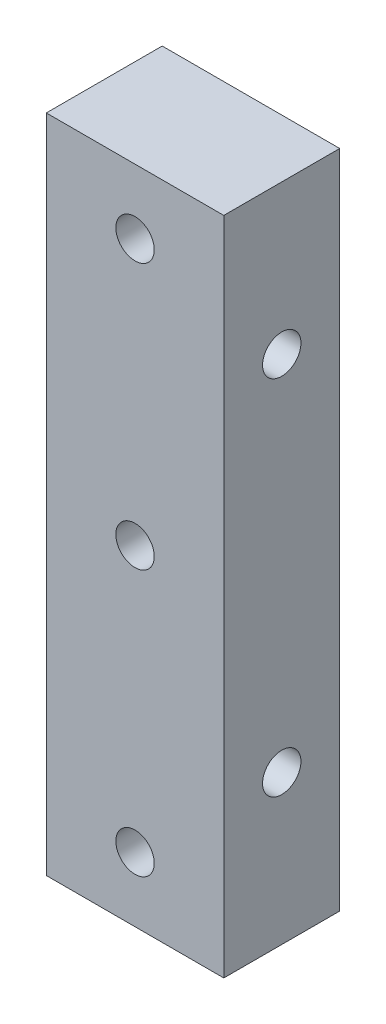
ISO-10303-21;
HEADER;
FILE_DESCRIPTION(('STEP AP214'),'2;1');
FILE_NAME('part.step','',(''),(''),'','','');
FILE_SCHEMA(('AUTOMOTIVE_DESIGN { 1 0 10303 214 1 1 1 1 }'));
ENDSEC;
DATA;
#1=APPLICATION_CONTEXT('core data for automotive mechanical design processes');
#2=APPLICATION_PROTOCOL_DEFINITION('international standard','automotive_design',2000,#1);
#3=PRODUCT_CONTEXT('',#1,'mechanical');
#4=PRODUCT('Part','Part','',(#3));
#5=PRODUCT_RELATED_PRODUCT_CATEGORY('part','',(#4));
#6=PRODUCT_DEFINITION_FORMATION('','',#4);
#7=PRODUCT_DEFINITION_CONTEXT('part definition',#1,'design');
#8=PRODUCT_DEFINITION('design','',#6,#7);
#9=PRODUCT_DEFINITION_SHAPE('','',#8);
#10=(LENGTH_UNIT() NAMED_UNIT(*) SI_UNIT(.MILLI.,.METRE.));
#11=(NAMED_UNIT(*) PLANE_ANGLE_UNIT() SI_UNIT($,.RADIAN.));
#12=(NAMED_UNIT(*) SI_UNIT($,.STERADIAN.) SOLID_ANGLE_UNIT());
#13=UNCERTAINTY_MEASURE_WITH_UNIT(LENGTH_MEASURE(1.E-05),#10,'distance_accuracy_value','');
#14=(GEOMETRIC_REPRESENTATION_CONTEXT(3) GLOBAL_UNCERTAINTY_ASSIGNED_CONTEXT((#13)) GLOBAL_UNIT_ASSIGNED_CONTEXT((#10,
#11,#12)) REPRESENTATION_CONTEXT('',''));
#15=CARTESIAN_POINT('',(0.,0.,0.));
#16=DIRECTION('',(0.,0.,1.));
#17=DIRECTION('',(1.,0.,0.));
#18=AXIS2_PLACEMENT_3D('',#15,#16,#17);
#19=CARTESIAN_POINT('',(9.33449999999999,34.7345,12.192));
#20=DIRECTION('',(-1.,0.,0.));
#21=DIRECTION('',(0.,-1.,0.));
#22=AXIS2_PLACEMENT_3D('',#19,#20,#21);
#23=PLANE('',#22);
#24=CARTESIAN_POINT('',(9.3345,19.05,6.09599999999999));
#25=DIRECTION('',(1.,0.,0.));
#26=DIRECTION('',(0.,0.,-1.));
#27=AXIS2_PLACEMENT_3D('',#24,#25,#26);
#28=CIRCLE('',#27,2.0193);
#29=CARTESIAN_POINT('',(9.3345,19.05,4.0767));
#30=VERTEX_POINT('',#29);
#31=EDGE_CURVE('E143',#30,#30,#28,.T.);
#32=ORIENTED_EDGE('',*,*,#31,.F.);
#33=EDGE_LOOP('',(#32));
#34=FACE_BOUND('',#33,.T.);
#35=CARTESIAN_POINT('',(9.3345,-19.05,6.09599999999999));
#36=DIRECTION('',(1.,0.,0.));
#37=DIRECTION('',(0.,0.,-1.));
#38=AXIS2_PLACEMENT_3D('',#35,#36,#37);
#39=CIRCLE('',#38,2.0193);
#40=CARTESIAN_POINT('',(9.3345,-19.05,4.0767));
#41=VERTEX_POINT('',#40);
#42=EDGE_CURVE('E135',#41,#41,#39,.T.);
#43=ORIENTED_EDGE('',*,*,#42,.F.);
#44=EDGE_LOOP('',(#43));
#45=FACE_BOUND('',#44,.T.);
#46=DIRECTION('',(0.,1.,0.));
#47=VECTOR('',#46,1.);
#48=CARTESIAN_POINT('',(9.33449999999999,34.7345,0.));
#49=LINE('',#48,#47);
#50=CARTESIAN_POINT('',(9.3345,-34.7345,0.));
#51=VERTEX_POINT('',#50);
#52=CARTESIAN_POINT('',(9.33449999999999,34.7345,0.));
#53=VERTEX_POINT('',#52);
#54=EDGE_CURVE('E111',#51,#53,#49,.T.);
#55=ORIENTED_EDGE('',*,*,#54,.T.);
#56=DIRECTION('',(0.,0.,-1.));
#57=VECTOR('',#56,1.);
#58=CARTESIAN_POINT('',(9.33449999999999,34.7345,12.192));
#59=LINE('',#58,#57);
#60=CARTESIAN_POINT('',(9.33449999999999,34.7345,12.192));
#61=VERTEX_POINT('',#60);
#62=EDGE_CURVE('E11',#61,#53,#59,.T.);
#63=ORIENTED_EDGE('',*,*,#62,.F.);
#64=DIRECTION('',(0.,1.,0.));
#65=VECTOR('',#64,1.);
#66=CARTESIAN_POINT('',(9.33449999999999,34.7345,12.192));
#67=LINE('',#66,#65);
#68=CARTESIAN_POINT('',(9.3345,-34.7345,12.192));
#69=VERTEX_POINT('',#68);
#70=EDGE_CURVE('E95',#69,#61,#67,.T.);
#71=ORIENTED_EDGE('',*,*,#70,.F.);
#72=DIRECTION('',(0.,0.,-1.));
#73=VECTOR('',#72,1.);
#74=CARTESIAN_POINT('',(9.3345,-34.7345,12.192));
#75=LINE('',#74,#73);
#76=EDGE_CURVE('E107',#69,#51,#75,.T.);
#77=ORIENTED_EDGE('',*,*,#76,.T.);
#78=EDGE_LOOP('',(#55,#63,#71,#77));
#79=FACE_BOUND('',#78,.T.);
#80=ADVANCED_FACE('F43',(#34,#45,#79),#23,.F.);
#81=CARTESIAN_POINT('',(-9.3345,34.7345,12.192));
#82=DIRECTION('',(0.,-1.,0.));
#83=DIRECTION('',(0.,0.,-1.));
#84=AXIS2_PLACEMENT_3D('',#81,#82,#83);
#85=PLANE('',#84);
#86=DIRECTION('',(-1.,0.,0.));
#87=VECTOR('',#86,1.);
#88=CARTESIAN_POINT('',(-9.3345,34.7345,0.));
#89=LINE('',#88,#87);
#90=CARTESIAN_POINT('',(-9.3345,34.7345,0.));
#91=VERTEX_POINT('',#90);
#92=EDGE_CURVE('E100',#53,#91,#89,.T.);
#93=ORIENTED_EDGE('',*,*,#92,.T.);
#94=DIRECTION('',(0.,0.,-1.));
#95=VECTOR('',#94,1.);
#96=CARTESIAN_POINT('',(-9.3345,34.7345,12.192));
#97=LINE('',#96,#95);
#98=CARTESIAN_POINT('',(-9.3345,34.7345,12.192));
#99=VERTEX_POINT('',#98);
#100=EDGE_CURVE('E52',#99,#91,#97,.T.);
#101=ORIENTED_EDGE('',*,*,#100,.F.);
#102=DIRECTION('',(-1.,0.,0.));
#103=VECTOR('',#102,1.);
#104=CARTESIAN_POINT('',(-9.3345,34.7345,12.192));
#105=LINE('',#104,#103);
#106=EDGE_CURVE('E90',#61,#99,#105,.T.);
#107=ORIENTED_EDGE('',*,*,#106,.F.);
#108=ORIENTED_EDGE('',*,*,#62,.T.);
#109=EDGE_LOOP('',(#93,#101,#107,#108));
#110=FACE_BOUND('',#109,.T.);
#111=ADVANCED_FACE('F99',(#110),#85,.F.);
#112=CARTESIAN_POINT('',(-9.3345,34.7345,12.192));
#113=DIRECTION('',(1.,0.,0.));
#114=DIRECTION('',(0.,1.,0.));
#115=AXIS2_PLACEMENT_3D('',#112,#113,#114);
#116=PLANE('',#115);
#117=CARTESIAN_POINT('',(-9.3345,19.05,6.09599999999999));
#118=DIRECTION('',(1.,0.,0.));
#119=DIRECTION('',(0.,0.,-1.));
#120=AXIS2_PLACEMENT_3D('',#117,#118,#119);
#121=CIRCLE('',#120,2.01929999999999);
#122=CARTESIAN_POINT('',(-9.3345,19.05,4.0767));
#123=VERTEX_POINT('',#122);
#124=EDGE_CURVE('E139',#123,#123,#121,.T.);
#125=ORIENTED_EDGE('',*,*,#124,.T.);
#126=EDGE_LOOP('',(#125));
#127=FACE_BOUND('',#126,.T.);
#128=CARTESIAN_POINT('',(-9.3345,-19.05,6.09599999999999));
#129=DIRECTION('',(1.,0.,0.));
#130=DIRECTION('',(0.,0.,-1.));
#131=AXIS2_PLACEMENT_3D('',#128,#129,#130);
#132=CIRCLE('',#131,2.01929999999999);
#133=CARTESIAN_POINT('',(-9.3345,-19.05,4.0767));
#134=VERTEX_POINT('',#133);
#135=EDGE_CURVE('E115',#134,#134,#132,.T.);
#136=ORIENTED_EDGE('',*,*,#135,.T.);
#137=EDGE_LOOP('',(#136));
#138=FACE_BOUND('',#137,.T.);
#139=DIRECTION('',(0.,-1.,0.));
#140=VECTOR('',#139,1.);
#141=CARTESIAN_POINT('',(-9.3345,34.7345,0.));
#142=LINE('',#141,#140);
#143=CARTESIAN_POINT('',(-9.33449999999999,-34.7345,0.));
#144=VERTEX_POINT('',#143);
#145=EDGE_CURVE('E77',#91,#144,#142,.T.);
#146=ORIENTED_EDGE('',*,*,#145,.T.);
#147=DIRECTION('',(0.,0.,-1.));
#148=VECTOR('',#147,1.);
#149=CARTESIAN_POINT('',(-9.33449999999999,-34.7345,12.192));
#150=LINE('',#149,#148);
#151=CARTESIAN_POINT('',(-9.33449999999999,-34.7345,12.192));
#152=VERTEX_POINT('',#151);
#153=EDGE_CURVE('E102',#152,#144,#150,.T.);
#154=ORIENTED_EDGE('',*,*,#153,.F.);
#155=DIRECTION('',(0.,-1.,0.));
#156=VECTOR('',#155,1.);
#157=CARTESIAN_POINT('',(-9.3345,34.7345,12.192));
#158=LINE('',#157,#156);
#159=EDGE_CURVE('E93',#99,#152,#158,.T.);
#160=ORIENTED_EDGE('',*,*,#159,.F.);
#161=ORIENTED_EDGE('',*,*,#100,.T.);
#162=EDGE_LOOP('',(#146,#154,#160,#161));
#163=FACE_BOUND('',#162,.T.);
#164=ADVANCED_FACE('F103',(#127,#138,#163),#116,.F.);
#165=CARTESIAN_POINT('',(-9.33449999999999,-34.7345,12.192));
#166=DIRECTION('',(0.,1.,0.));
#167=DIRECTION('',(0.,0.,1.));
#168=AXIS2_PLACEMENT_3D('',#165,#166,#167);
#169=PLANE('',#168);
#170=DIRECTION('',(1.,0.,0.));
#171=VECTOR('',#170,1.);
#172=CARTESIAN_POINT('',(-9.33449999999999,-34.7345,0.));
#173=LINE('',#172,#171);
#174=EDGE_CURVE('E83',#144,#51,#173,.T.);
#175=ORIENTED_EDGE('',*,*,#174,.T.);
#176=ORIENTED_EDGE('',*,*,#76,.F.);
#177=DIRECTION('',(1.,0.,0.));
#178=VECTOR('',#177,1.);
#179=CARTESIAN_POINT('',(-9.33449999999999,-34.7345,12.192));
#180=LINE('',#179,#178);
#181=EDGE_CURVE('E60',#152,#69,#180,.T.);
#182=ORIENTED_EDGE('',*,*,#181,.F.);
#183=ORIENTED_EDGE('',*,*,#153,.T.);
#184=EDGE_LOOP('',(#175,#176,#182,#183));
#185=FACE_BOUND('',#184,.T.);
#186=ADVANCED_FACE('F125',(#185),#169,.F.);
#187=CARTESIAN_POINT('',(0.,0.,12.192));
#188=DIRECTION('',(0.,0.,1.));
#189=DIRECTION('',(1.,0.,0.));
#190=AXIS2_PLACEMENT_3D('',#187,#188,#189);
#191=PLANE('',#190);
#192=CARTESIAN_POINT('',(0.,27.94,12.192));
#193=DIRECTION('',(0.,0.,1.));
#194=DIRECTION('',(1.,0.,0.));
#195=AXIS2_PLACEMENT_3D('',#192,#193,#194);
#196=CIRCLE('',#195,2.01929999999999);
#197=CARTESIAN_POINT('',(2.01929999999998,27.94,12.192));
#198=VERTEX_POINT('',#197);
#199=EDGE_CURVE('E167',#198,#198,#196,.T.);
#200=ORIENTED_EDGE('',*,*,#199,.F.);
#201=EDGE_LOOP('',(#200));
#202=FACE_BOUND('',#201,.T.);
#203=CARTESIAN_POINT('',(0.,-27.94,12.192));
#204=DIRECTION('',(0.,0.,1.));
#205=DIRECTION('',(1.,0.,0.));
#206=AXIS2_PLACEMENT_3D('',#203,#204,#205);
#207=CIRCLE('',#206,2.01929999999999);
#208=CARTESIAN_POINT('',(2.01929999999999,-27.94,12.192));
#209=VERTEX_POINT('',#208);
#210=EDGE_CURVE('E159',#209,#209,#207,.T.);
#211=ORIENTED_EDGE('',*,*,#210,.F.);
#212=EDGE_LOOP('',(#211));
#213=FACE_BOUND('',#212,.T.);
#214=CARTESIAN_POINT('',(0.,0.,12.192));
#215=DIRECTION('',(0.,0.,1.));
#216=DIRECTION('',(1.,0.,0.));
#217=AXIS2_PLACEMENT_3D('',#214,#215,#216);
#218=CIRCLE('',#217,2.01929999999999);
#219=CARTESIAN_POINT('',(2.01929999999999,0.,12.192));
#220=VERTEX_POINT('',#219);
#221=EDGE_CURVE('E151',#220,#220,#218,.T.);
#222=ORIENTED_EDGE('',*,*,#221,.F.);
#223=EDGE_LOOP('',(#222));
#224=FACE_BOUND('',#223,.T.);
#225=ORIENTED_EDGE('',*,*,#70,.T.);
#226=ORIENTED_EDGE('',*,*,#106,.T.);
#227=ORIENTED_EDGE('',*,*,#159,.T.);
#228=ORIENTED_EDGE('',*,*,#181,.T.);
#229=EDGE_LOOP('',(#225,#226,#227,#228));
#230=FACE_BOUND('',#229,.T.);
#231=ADVANCED_FACE('F91',(#202,#213,#224,#230),#191,.T.);
#232=CARTESIAN_POINT('',(0.,0.,0.));
#233=DIRECTION('',(0.,0.,1.));
#234=DIRECTION('',(1.,0.,0.));
#235=AXIS2_PLACEMENT_3D('',#232,#233,#234);
#236=PLANE('',#235);
#237=CARTESIAN_POINT('',(0.,27.94,0.));
#238=DIRECTION('',(0.,0.,1.));
#239=DIRECTION('',(1.,0.,0.));
#240=AXIS2_PLACEMENT_3D('',#237,#238,#239);
#241=CIRCLE('',#240,2.0193);
#242=CARTESIAN_POINT('',(2.01929999999999,27.94,0.));
#243=VERTEX_POINT('',#242);
#244=EDGE_CURVE('E163',#243,#243,#241,.T.);
#245=ORIENTED_EDGE('',*,*,#244,.T.);
#246=EDGE_LOOP('',(#245));
#247=FACE_BOUND('',#246,.T.);
#248=CARTESIAN_POINT('',(0.,-27.94,0.));
#249=DIRECTION('',(0.,0.,1.));
#250=DIRECTION('',(1.,0.,0.));
#251=AXIS2_PLACEMENT_3D('',#248,#249,#250);
#252=CIRCLE('',#251,2.0193);
#253=CARTESIAN_POINT('',(2.0193,-27.94,0.));
#254=VERTEX_POINT('',#253);
#255=EDGE_CURVE('E155',#254,#254,#252,.T.);
#256=ORIENTED_EDGE('',*,*,#255,.T.);
#257=EDGE_LOOP('',(#256));
#258=FACE_BOUND('',#257,.T.);
#259=CARTESIAN_POINT('',(0.,0.,0.));
#260=DIRECTION('',(0.,0.,1.));
#261=DIRECTION('',(1.,0.,0.));
#262=AXIS2_PLACEMENT_3D('',#259,#260,#261);
#263=CIRCLE('',#262,2.0193);
#264=CARTESIAN_POINT('',(2.0193,0.,0.));
#265=VERTEX_POINT('',#264);
#266=EDGE_CURVE('E147',#265,#265,#263,.T.);
#267=ORIENTED_EDGE('',*,*,#266,.T.);
#268=EDGE_LOOP('',(#267));
#269=FACE_BOUND('',#268,.T.);
#270=ORIENTED_EDGE('',*,*,#54,.F.);
#271=ORIENTED_EDGE('',*,*,#174,.F.);
#272=ORIENTED_EDGE('',*,*,#145,.F.);
#273=ORIENTED_EDGE('',*,*,#92,.F.);
#274=EDGE_LOOP('',(#270,#271,#272,#273));
#275=FACE_BOUND('',#274,.T.);
#276=ADVANCED_FACE('F128',(#247,#258,#269,#275),#236,.F.);
#277=CARTESIAN_POINT('',(9.3345,-19.05,6.09599999999999));
#278=DIRECTION('',(1.,0.,0.));
#279=DIRECTION('',(0.,0.,-1.));
#280=AXIS2_PLACEMENT_3D('',#277,#278,#279);
#281=CYLINDRICAL_SURFACE('',#280,2.0193);
#282=ORIENTED_EDGE('',*,*,#135,.F.);
#283=EDGE_LOOP('',(#282));
#284=FACE_BOUND('',#283,.T.);
#285=ORIENTED_EDGE('',*,*,#42,.T.);
#286=EDGE_LOOP('',(#285));
#287=FACE_BOUND('',#286,.T.);
#288=ADVANCED_FACE('F193',(#284,#287),#281,.F.);
#289=CARTESIAN_POINT('',(9.3345,19.05,6.09599999999999));
#290=DIRECTION('',(1.,0.,0.));
#291=DIRECTION('',(0.,0.,-1.));
#292=AXIS2_PLACEMENT_3D('',#289,#290,#291);
#293=CYLINDRICAL_SURFACE('',#292,2.0193);
#294=ORIENTED_EDGE('',*,*,#124,.F.);
#295=EDGE_LOOP('',(#294));
#296=FACE_BOUND('',#295,.T.);
#297=ORIENTED_EDGE('',*,*,#31,.T.);
#298=EDGE_LOOP('',(#297));
#299=FACE_BOUND('',#298,.T.);
#300=ADVANCED_FACE('F184',(#296,#299),#293,.F.);
#301=CARTESIAN_POINT('',(0.,0.,12.192));
#302=DIRECTION('',(0.,0.,1.));
#303=DIRECTION('',(1.,0.,0.));
#304=AXIS2_PLACEMENT_3D('',#301,#302,#303);
#305=CYLINDRICAL_SURFACE('',#304,2.01929999999999);
#306=ORIENTED_EDGE('',*,*,#266,.F.);
#307=EDGE_LOOP('',(#306));
#308=FACE_BOUND('',#307,.T.);
#309=ORIENTED_EDGE('',*,*,#221,.T.);
#310=EDGE_LOOP('',(#309));
#311=FACE_BOUND('',#310,.T.);
#312=ADVANCED_FACE('F181',(#308,#311),#305,.F.);
#313=CARTESIAN_POINT('',(0.,-27.94,12.192));
#314=DIRECTION('',(0.,0.,1.));
#315=DIRECTION('',(1.,0.,0.));
#316=AXIS2_PLACEMENT_3D('',#313,#314,#315);
#317=CYLINDRICAL_SURFACE('',#316,2.01929999999999);
#318=ORIENTED_EDGE('',*,*,#255,.F.);
#319=EDGE_LOOP('',(#318));
#320=FACE_BOUND('',#319,.T.);
#321=ORIENTED_EDGE('',*,*,#210,.T.);
#322=EDGE_LOOP('',(#321));
#323=FACE_BOUND('',#322,.T.);
#324=ADVANCED_FACE('F183',(#320,#323),#317,.F.);
#325=CARTESIAN_POINT('',(0.,27.94,12.192));
#326=DIRECTION('',(0.,0.,1.));
#327=DIRECTION('',(1.,0.,0.));
#328=AXIS2_PLACEMENT_3D('',#325,#326,#327);
#329=CYLINDRICAL_SURFACE('',#328,2.01929999999999);
#330=ORIENTED_EDGE('',*,*,#244,.F.);
#331=EDGE_LOOP('',(#330));
#332=FACE_BOUND('',#331,.T.);
#333=ORIENTED_EDGE('',*,*,#199,.T.);
#334=EDGE_LOOP('',(#333));
#335=FACE_BOUND('',#334,.T.);
#336=ADVANCED_FACE('F172',(#332,#335),#329,.F.);
#337=CLOSED_SHELL('',(#80,#111,#164,#186,#231,#276,#288,#300,#312,#324,#336));
#338=MANIFOLD_SOLID_BREP('B2',#337);
#339=ADVANCED_BREP_SHAPE_REPRESENTATION('',(#18,#338),#14);
#340=SHAPE_DEFINITION_REPRESENTATION(#9,#339);
ENDSEC;
END-ISO-10303-21;
